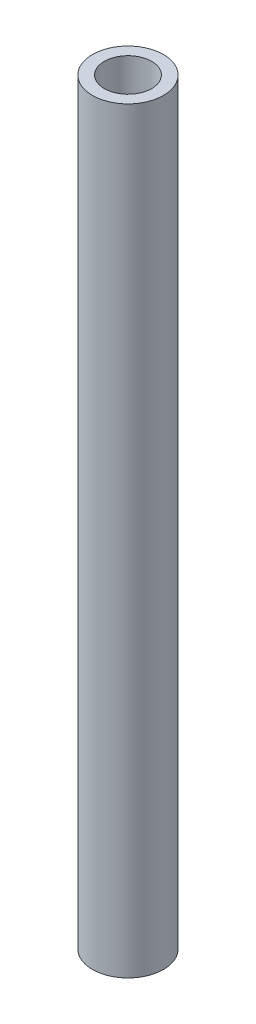
ISO-10303-21;
HEADER;
FILE_DESCRIPTION(('STEP AP214'),'2;1');
FILE_NAME('part.step','',(''),(''),'','','');
FILE_SCHEMA(('AUTOMOTIVE_DESIGN { 1 0 10303 214 1 1 1 1 }'));
ENDSEC;
DATA;
#1=APPLICATION_CONTEXT('core data for automotive mechanical design processes');
#2=APPLICATION_PROTOCOL_DEFINITION('international standard','automotive_design',2000,#1);
#3=PRODUCT_CONTEXT('',#1,'mechanical');
#4=PRODUCT('Part','Part','',(#3));
#5=PRODUCT_RELATED_PRODUCT_CATEGORY('part','',(#4));
#6=PRODUCT_DEFINITION_FORMATION('','',#4);
#7=PRODUCT_DEFINITION_CONTEXT('part definition',#1,'design');
#8=PRODUCT_DEFINITION('design','',#6,#7);
#9=PRODUCT_DEFINITION_SHAPE('','',#8);
#10=(LENGTH_UNIT() NAMED_UNIT(*) SI_UNIT(.MILLI.,.METRE.));
#11=(NAMED_UNIT(*) PLANE_ANGLE_UNIT() SI_UNIT($,.RADIAN.));
#12=(NAMED_UNIT(*) SI_UNIT($,.STERADIAN.) SOLID_ANGLE_UNIT());
#13=UNCERTAINTY_MEASURE_WITH_UNIT(LENGTH_MEASURE(1.E-05),#10,'distance_accuracy_value','');
#14=(GEOMETRIC_REPRESENTATION_CONTEXT(3) GLOBAL_UNCERTAINTY_ASSIGNED_CONTEXT((#13)) GLOBAL_UNIT_ASSIGNED_CONTEXT((#10,
#11,#12)) REPRESENTATION_CONTEXT('',''));
#15=CARTESIAN_POINT('',(0.,0.,0.));
#16=DIRECTION('',(0.,0.,1.));
#17=DIRECTION('',(1.,0.,0.));
#18=AXIS2_PLACEMENT_3D('',#15,#16,#17);
#19=CARTESIAN_POINT('',(0.,50.8,0.));
#20=DIRECTION('',(0.,1.,0.));
#21=DIRECTION('',(0.,0.,1.));
#22=AXIS2_PLACEMENT_3D('',#19,#20,#21);
#23=PLANE('',#22);
#24=CARTESIAN_POINT('',(0.,50.8,0.));
#25=DIRECTION('',(0.,1.,0.));
#26=DIRECTION('',(0.,0.,1.));
#27=AXIS2_PLACEMENT_3D('',#24,#25,#26);
#28=CIRCLE('',#27,2.38125);
#29=CARTESIAN_POINT('',(0.,50.8,2.38125));
#30=VERTEX_POINT('',#29);
#31=EDGE_CURVE('E10',#30,#30,#28,.T.);
#32=ORIENTED_EDGE('',*,*,#31,.T.);
#33=EDGE_LOOP('',(#32));
#34=FACE_BOUND('',#33,.T.);
#35=CARTESIAN_POINT('',(0.,50.8,0.));
#36=DIRECTION('',(0.,1.,0.));
#37=DIRECTION('',(0.,0.,1.));
#38=AXIS2_PLACEMENT_3D('',#35,#36,#37);
#39=CIRCLE('',#38,1.5875);
#40=CARTESIAN_POINT('',(0.,50.8,1.5875));
#41=VERTEX_POINT('',#40);
#42=EDGE_CURVE('E44',#41,#41,#39,.T.);
#43=ORIENTED_EDGE('',*,*,#42,.F.);
#44=EDGE_LOOP('',(#43));
#45=FACE_BOUND('',#44,.T.);
#46=ADVANCED_FACE('F33',(#34,#45),#23,.T.);
#47=CARTESIAN_POINT('',(0.,0.,0.));
#48=DIRECTION('',(0.,1.,0.));
#49=DIRECTION('',(0.,0.,1.));
#50=AXIS2_PLACEMENT_3D('',#47,#48,#49);
#51=PLANE('',#50);
#52=CARTESIAN_POINT('',(0.,0.,0.));
#53=DIRECTION('',(0.,1.,0.));
#54=DIRECTION('',(0.,0.,1.));
#55=AXIS2_PLACEMENT_3D('',#52,#53,#54);
#56=CIRCLE('',#55,2.38125);
#57=CARTESIAN_POINT('',(0.,0.,2.38125));
#58=VERTEX_POINT('',#57);
#59=EDGE_CURVE('E37',#58,#58,#56,.T.);
#60=ORIENTED_EDGE('',*,*,#59,.F.);
#61=EDGE_LOOP('',(#60));
#62=FACE_BOUND('',#61,.T.);
#63=CARTESIAN_POINT('',(0.,0.,0.));
#64=DIRECTION('',(0.,1.,0.));
#65=DIRECTION('',(0.,0.,1.));
#66=AXIS2_PLACEMENT_3D('',#63,#64,#65);
#67=CIRCLE('',#66,1.5875);
#68=CARTESIAN_POINT('',(0.,0.,1.5875));
#69=VERTEX_POINT('',#68);
#70=EDGE_CURVE('E46',#69,#69,#67,.T.);
#71=ORIENTED_EDGE('',*,*,#70,.T.);
#72=EDGE_LOOP('',(#71));
#73=FACE_BOUND('',#72,.T.);
#74=ADVANCED_FACE('F56',(#62,#73),#51,.F.);
#75=CARTESIAN_POINT('',(0.,50.8,0.));
#76=DIRECTION('',(0.,-1.,0.));
#77=DIRECTION('',(0.,0.,-1.));
#78=AXIS2_PLACEMENT_3D('',#75,#76,#77);
#79=CYLINDRICAL_SURFACE('',#78,2.38125);
#80=ORIENTED_EDGE('',*,*,#31,.F.);
#81=EDGE_LOOP('',(#80));
#82=FACE_BOUND('',#81,.T.);
#83=ORIENTED_EDGE('',*,*,#59,.T.);
#84=EDGE_LOOP('',(#83));
#85=FACE_BOUND('',#84,.T.);
#86=ADVANCED_FACE('F35',(#82,#85),#79,.T.);
#87=CARTESIAN_POINT('',(0.,50.8,0.));
#88=DIRECTION('',(0.,-1.,0.));
#89=DIRECTION('',(0.,0.,-1.));
#90=AXIS2_PLACEMENT_3D('',#87,#88,#89);
#91=CYLINDRICAL_SURFACE('',#90,1.5875);
#92=ORIENTED_EDGE('',*,*,#42,.T.);
#93=EDGE_LOOP('',(#92));
#94=FACE_BOUND('',#93,.T.);
#95=ORIENTED_EDGE('',*,*,#70,.F.);
#96=EDGE_LOOP('',(#95));
#97=FACE_BOUND('',#96,.T.);
#98=ADVANCED_FACE('F52',(#94,#97),#91,.F.);
#99=CLOSED_SHELL('',(#46,#74,#86,#98));
#100=MANIFOLD_SOLID_BREP('B2',#99);
#101=ADVANCED_BREP_SHAPE_REPRESENTATION('',(#18,#100),#14);
#102=SHAPE_DEFINITION_REPRESENTATION(#9,#101);
ENDSEC;
END-ISO-10303-21;
